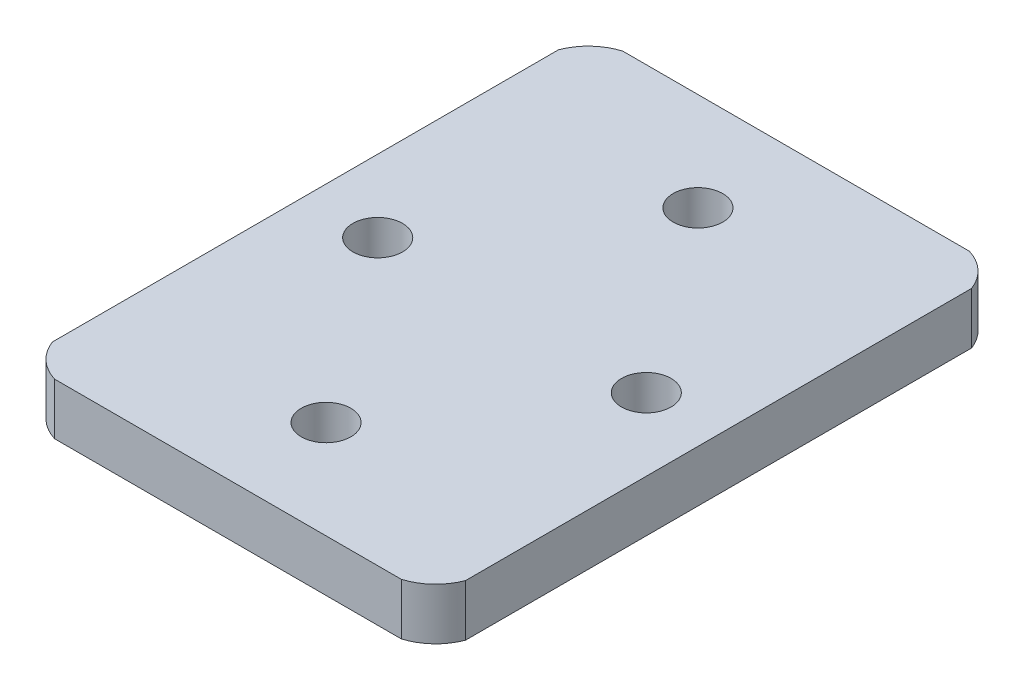
ISO-10303-21;
HEADER;
FILE_DESCRIPTION(('STEP AP214'),'2;1');
FILE_NAME('part.step','',(''),(''),'','','');
FILE_SCHEMA(('AUTOMOTIVE_DESIGN { 1 0 10303 214 1 1 1 1 }'));
ENDSEC;
DATA;
#1=APPLICATION_CONTEXT('core data for automotive mechanical design processes');
#2=APPLICATION_PROTOCOL_DEFINITION('international standard','automotive_design',2000,#1);
#3=PRODUCT_CONTEXT('',#1,'mechanical');
#4=PRODUCT('Part','Part','',(#3));
#5=PRODUCT_RELATED_PRODUCT_CATEGORY('part','',(#4));
#6=PRODUCT_DEFINITION_FORMATION('','',#4);
#7=PRODUCT_DEFINITION_CONTEXT('part definition',#1,'design');
#8=PRODUCT_DEFINITION('design','',#6,#7);
#9=PRODUCT_DEFINITION_SHAPE('','',#8);
#10=(LENGTH_UNIT() NAMED_UNIT(*) SI_UNIT(.MILLI.,.METRE.));
#11=(NAMED_UNIT(*) PLANE_ANGLE_UNIT() SI_UNIT($,.RADIAN.));
#12=(NAMED_UNIT(*) SI_UNIT($,.STERADIAN.) SOLID_ANGLE_UNIT());
#13=UNCERTAINTY_MEASURE_WITH_UNIT(LENGTH_MEASURE(1.E-05),#10,'distance_accuracy_value','');
#14=(GEOMETRIC_REPRESENTATION_CONTEXT(3) GLOBAL_UNCERTAINTY_ASSIGNED_CONTEXT((#13)) GLOBAL_UNIT_ASSIGNED_CONTEXT((#10,
#11,#12)) REPRESENTATION_CONTEXT('',''));
#15=CARTESIAN_POINT('',(0.,0.,0.));
#16=DIRECTION('',(0.,0.,1.));
#17=DIRECTION('',(1.,0.,0.));
#18=AXIS2_PLACEMENT_3D('',#15,#16,#17);
#19=CARTESIAN_POINT('',(15.3292042593997,5.,-28.2283542208789));
#20=DIRECTION('',(0.,-1.,0.));
#21=DIRECTION('',(0.,0.,-1.));
#22=AXIS2_PLACEMENT_3D('',#19,#20,#21);
#23=PLANE('',#22);
#24=CARTESIAN_POINT('',(15.3292042593997,5.,-28.2283542208789));
#25=DIRECTION('',(0.,1.,0.));
#26=DIRECTION('',(0.,0.,-1.));
#27=AXIS2_PLACEMENT_3D('',#24,#25,#26);
#28=CIRCLE('',#27,5.);
#29=CARTESIAN_POINT('',(20.,5.,-30.012637592317));
#30=VERTEX_POINT('',#29);
#31=CARTESIAN_POINT('',(16.7820059051109,5.,-33.012637592317));
#32=VERTEX_POINT('',#31);
#33=EDGE_CURVE('E149',#30,#32,#28,.T.);
#34=ORIENTED_EDGE('',*,*,#33,.T.);
#35=DIRECTION('',(-1.,0.,0.));
#36=VECTOR('',#35,1.);
#37=CARTESIAN_POINT('',(-16.7820059051109,5.,-33.012637592317));
#38=LINE('',#37,#36);
#39=CARTESIAN_POINT('',(-16.7820059051109,5.,-33.012637592317));
#40=VERTEX_POINT('',#39);
#41=EDGE_CURVE('E97',#32,#40,#38,.T.);
#42=ORIENTED_EDGE('',*,*,#41,.T.);
#43=CARTESIAN_POINT('',(-15.3292042593997,5.,-28.2283542208789));
#44=DIRECTION('',(0.,1.,0.));
#45=DIRECTION('',(0.,0.,1.));
#46=AXIS2_PLACEMENT_3D('',#43,#44,#45);
#47=CIRCLE('',#46,5.);
#48=CARTESIAN_POINT('',(-20.,5.,-30.012637592317));
#49=VERTEX_POINT('',#48);
#50=EDGE_CURVE('E164',#40,#49,#47,.T.);
#51=ORIENTED_EDGE('',*,*,#50,.T.);
#52=DIRECTION('',(0.,0.,1.));
#53=VECTOR('',#52,1.);
#54=CARTESIAN_POINT('',(-20.,5.,-30.012637592317));
#55=LINE('',#54,#53);
#56=CARTESIAN_POINT('',(-20.,5.,18.987362407683));
#57=VERTEX_POINT('',#56);
#58=EDGE_CURVE('E177',#49,#57,#55,.T.);
#59=ORIENTED_EDGE('',*,*,#58,.T.);
#60=CARTESIAN_POINT('',(-15.3292042593997,5.,17.2030790362449));
#61=DIRECTION('',(0.,1.,0.));
#62=DIRECTION('',(0.,0.,-1.));
#63=AXIS2_PLACEMENT_3D('',#60,#61,#62);
#64=CIRCLE('',#63,5.00000000000001);
#65=CARTESIAN_POINT('',(-16.7820059051109,5.,21.987362407683));
#66=VERTEX_POINT('',#65);
#67=EDGE_CURVE('E116',#57,#66,#64,.T.);
#68=ORIENTED_EDGE('',*,*,#67,.T.);
#69=DIRECTION('',(1.,0.,0.));
#70=VECTOR('',#69,1.);
#71=CARTESIAN_POINT('',(16.7820059051109,5.,21.987362407683));
#72=LINE('',#71,#70);
#73=CARTESIAN_POINT('',(16.7820059051109,5.,21.987362407683));
#74=VERTEX_POINT('',#73);
#75=EDGE_CURVE('E110',#66,#74,#72,.T.);
#76=ORIENTED_EDGE('',*,*,#75,.T.);
#77=CARTESIAN_POINT('',(15.3292042593997,5.,17.2030790362449));
#78=DIRECTION('',(0.,1.,0.));
#79=DIRECTION('',(0.,0.,1.));
#80=AXIS2_PLACEMENT_3D('',#77,#78,#79);
#81=CIRCLE('',#80,5.00000000000002);
#82=CARTESIAN_POINT('',(20.,5.,18.987362407683));
#83=VERTEX_POINT('',#82);
#84=EDGE_CURVE('E114',#74,#83,#81,.T.);
#85=ORIENTED_EDGE('',*,*,#84,.T.);
#86=DIRECTION('',(0.,0.,-1.));
#87=VECTOR('',#86,1.);
#88=CARTESIAN_POINT('',(20.,5.,-30.012637592317));
#89=LINE('',#88,#87);
#90=EDGE_CURVE('E54',#83,#30,#89,.T.);
#91=ORIENTED_EDGE('',*,*,#90,.T.);
#92=EDGE_LOOP('',(#34,#42,#51,#59,#68,#76,#85,#91));
#93=FACE_BOUND('',#92,.T.);
#94=CARTESIAN_POINT('',(0.,5.,-23.512637592317));
#95=DIRECTION('',(0.,1.,0.));
#96=DIRECTION('',(0.,0.,1.));
#97=AXIS2_PLACEMENT_3D('',#94,#95,#96);
#98=CIRCLE('',#97,2.4);
#99=CARTESIAN_POINT('',(0.,5.,-21.112637592317));
#100=VERTEX_POINT('',#99);
#101=EDGE_CURVE('E138',#100,#100,#98,.T.);
#102=ORIENTED_EDGE('',*,*,#101,.F.);
#103=EDGE_LOOP('',(#102));
#104=FACE_BOUND('',#103,.T.);
#105=CARTESIAN_POINT('',(-13.,5.,-5.51263759231702));
#106=DIRECTION('',(0.,1.,0.));
#107=DIRECTION('',(0.,0.,1.));
#108=AXIS2_PLACEMENT_3D('',#105,#106,#107);
#109=CIRCLE('',#108,2.4);
#110=CARTESIAN_POINT('',(-13.,5.,-3.11263759231702));
#111=VERTEX_POINT('',#110);
#112=EDGE_CURVE('E186',#111,#111,#109,.T.);
#113=ORIENTED_EDGE('',*,*,#112,.F.);
#114=EDGE_LOOP('',(#113));
#115=FACE_BOUND('',#114,.T.);
#116=CARTESIAN_POINT('',(0.,5.,12.487362407683));
#117=DIRECTION('',(0.,1.,0.));
#118=DIRECTION('',(0.,0.,-1.));
#119=AXIS2_PLACEMENT_3D('',#116,#117,#118);
#120=CIRCLE('',#119,2.4);
#121=CARTESIAN_POINT('',(0.,5.,10.087362407683));
#122=VERTEX_POINT('',#121);
#123=EDGE_CURVE('E192',#122,#122,#120,.T.);
#124=ORIENTED_EDGE('',*,*,#123,.F.);
#125=EDGE_LOOP('',(#124));
#126=FACE_BOUND('',#125,.T.);
#127=CARTESIAN_POINT('',(13.,5.,-5.51263759231703));
#128=DIRECTION('',(0.,1.,0.));
#129=DIRECTION('',(0.,0.,-1.));
#130=AXIS2_PLACEMENT_3D('',#127,#128,#129);
#131=CIRCLE('',#130,2.4);
#132=CARTESIAN_POINT('',(13.,5.,-7.91263759231703));
#133=VERTEX_POINT('',#132);
#134=EDGE_CURVE('E198',#133,#133,#131,.T.);
#135=ORIENTED_EDGE('',*,*,#134,.F.);
#136=EDGE_LOOP('',(#135));
#137=FACE_BOUND('',#136,.T.);
#138=ADVANCED_FACE('F37',(#93,#104,#115,#126,#137),#23,.F.);
#139=CARTESIAN_POINT('',(15.3292042593997,0.,-28.2283542208789));
#140=DIRECTION('',(0.,-1.,0.));
#141=DIRECTION('',(0.,0.,-1.));
#142=AXIS2_PLACEMENT_3D('',#139,#140,#141);
#143=PLANE('',#142);
#144=CARTESIAN_POINT('',(0.,0.,12.487362407683));
#145=DIRECTION('',(0.,1.,0.));
#146=DIRECTION('',(0.,0.,-1.));
#147=AXIS2_PLACEMENT_3D('',#144,#145,#146);
#148=CIRCLE('',#147,2.4);
#149=CARTESIAN_POINT('',(0.,0.,10.087362407683));
#150=VERTEX_POINT('',#149);
#151=EDGE_CURVE('E195',#150,#150,#148,.T.);
#152=ORIENTED_EDGE('',*,*,#151,.T.);
#153=EDGE_LOOP('',(#152));
#154=FACE_BOUND('',#153,.T.);
#155=CARTESIAN_POINT('',(0.,0.,-23.512637592317));
#156=DIRECTION('',(0.,1.,0.));
#157=DIRECTION('',(0.,0.,1.));
#158=AXIS2_PLACEMENT_3D('',#155,#156,#157);
#159=CIRCLE('',#158,2.4);
#160=CARTESIAN_POINT('',(0.,0.,-21.112637592317));
#161=VERTEX_POINT('',#160);
#162=EDGE_CURVE('E183',#161,#161,#159,.T.);
#163=ORIENTED_EDGE('',*,*,#162,.T.);
#164=EDGE_LOOP('',(#163));
#165=FACE_BOUND('',#164,.T.);
#166=CARTESIAN_POINT('',(15.3292042593997,0.,-28.2283542208789));
#167=DIRECTION('',(0.,1.,0.));
#168=DIRECTION('',(0.,0.,-1.));
#169=AXIS2_PLACEMENT_3D('',#166,#167,#168);
#170=CIRCLE('',#169,5.);
#171=CARTESIAN_POINT('',(20.,0.,-30.012637592317));
#172=VERTEX_POINT('',#171);
#173=CARTESIAN_POINT('',(16.7820059051109,0.,-33.012637592317));
#174=VERTEX_POINT('',#173);
#175=EDGE_CURVE('E134',#172,#174,#170,.T.);
#176=ORIENTED_EDGE('',*,*,#175,.F.);
#177=DIRECTION('',(0.,0.,-1.));
#178=VECTOR('',#177,1.);
#179=CARTESIAN_POINT('',(20.,0.,-30.012637592317));
#180=LINE('',#179,#178);
#181=CARTESIAN_POINT('',(20.,0.,18.987362407683));
#182=VERTEX_POINT('',#181);
#183=EDGE_CURVE('E89',#182,#172,#180,.T.);
#184=ORIENTED_EDGE('',*,*,#183,.F.);
#185=CARTESIAN_POINT('',(15.3292042593997,0.,17.2030790362449));
#186=DIRECTION('',(0.,1.,0.));
#187=DIRECTION('',(0.,0.,1.));
#188=AXIS2_PLACEMENT_3D('',#185,#186,#187);
#189=CIRCLE('',#188,5.00000000000002);
#190=CARTESIAN_POINT('',(16.7820059051109,0.,21.987362407683));
#191=VERTEX_POINT('',#190);
#192=EDGE_CURVE('E83',#191,#182,#189,.T.);
#193=ORIENTED_EDGE('',*,*,#192,.F.);
#194=DIRECTION('',(1.,0.,0.));
#195=VECTOR('',#194,1.);
#196=CARTESIAN_POINT('',(16.7820059051109,0.,21.987362407683));
#197=LINE('',#196,#195);
#198=CARTESIAN_POINT('',(-16.7820059051109,0.,21.987362407683));
#199=VERTEX_POINT('',#198);
#200=EDGE_CURVE('E124',#199,#191,#197,.T.);
#201=ORIENTED_EDGE('',*,*,#200,.F.);
#202=CARTESIAN_POINT('',(-15.3292042593997,0.,17.2030790362449));
#203=DIRECTION('',(0.,1.,0.));
#204=DIRECTION('',(0.,0.,-1.));
#205=AXIS2_PLACEMENT_3D('',#202,#203,#204);
#206=CIRCLE('',#205,5.00000000000001);
#207=CARTESIAN_POINT('',(-20.,0.,18.987362407683));
#208=VERTEX_POINT('',#207);
#209=EDGE_CURVE('E144',#208,#199,#206,.T.);
#210=ORIENTED_EDGE('',*,*,#209,.F.);
#211=DIRECTION('',(0.,0.,1.));
#212=VECTOR('',#211,1.);
#213=CARTESIAN_POINT('',(-20.,0.,-30.012637592317));
#214=LINE('',#213,#212);
#215=CARTESIAN_POINT('',(-20.,0.,-30.012637592317));
#216=VERTEX_POINT('',#215);
#217=EDGE_CURVE('E142',#216,#208,#214,.T.);
#218=ORIENTED_EDGE('',*,*,#217,.F.);
#219=CARTESIAN_POINT('',(-15.3292042593997,0.,-28.2283542208789));
#220=DIRECTION('',(0.,1.,0.));
#221=DIRECTION('',(0.,0.,1.));
#222=AXIS2_PLACEMENT_3D('',#219,#220,#221);
#223=CIRCLE('',#222,5.);
#224=CARTESIAN_POINT('',(-16.7820059051109,0.,-33.012637592317));
#225=VERTEX_POINT('',#224);
#226=EDGE_CURVE('E140',#225,#216,#223,.T.);
#227=ORIENTED_EDGE('',*,*,#226,.F.);
#228=DIRECTION('',(-1.,0.,0.));
#229=VECTOR('',#228,1.);
#230=CARTESIAN_POINT('',(-16.7820059051109,0.,-33.012637592317));
#231=LINE('',#230,#229);
#232=EDGE_CURVE('E137',#174,#225,#231,.T.);
#233=ORIENTED_EDGE('',*,*,#232,.F.);
#234=EDGE_LOOP('',(#176,#184,#193,#201,#210,#218,#227,#233));
#235=FACE_BOUND('',#234,.T.);
#236=CARTESIAN_POINT('',(-13.,0.,-5.51263759231702));
#237=DIRECTION('',(0.,1.,0.));
#238=DIRECTION('',(0.,0.,1.));
#239=AXIS2_PLACEMENT_3D('',#236,#237,#238);
#240=CIRCLE('',#239,2.4);
#241=CARTESIAN_POINT('',(-13.,0.,-3.11263759231702));
#242=VERTEX_POINT('',#241);
#243=EDGE_CURVE('E189',#242,#242,#240,.T.);
#244=ORIENTED_EDGE('',*,*,#243,.T.);
#245=EDGE_LOOP('',(#244));
#246=FACE_BOUND('',#245,.T.);
#247=CARTESIAN_POINT('',(13.,0.,-5.51263759231703));
#248=DIRECTION('',(0.,1.,0.));
#249=DIRECTION('',(0.,0.,-1.));
#250=AXIS2_PLACEMENT_3D('',#247,#248,#249);
#251=CIRCLE('',#250,2.4);
#252=CARTESIAN_POINT('',(13.,0.,-7.91263759231703));
#253=VERTEX_POINT('',#252);
#254=EDGE_CURVE('E201',#253,#253,#251,.T.);
#255=ORIENTED_EDGE('',*,*,#254,.T.);
#256=EDGE_LOOP('',(#255));
#257=FACE_BOUND('',#256,.T.);
#258=ADVANCED_FACE('F168',(#154,#165,#235,#246,#257),#143,.T.);
#259=CARTESIAN_POINT('',(15.3292042593997,5.,-28.2283542208789));
#260=DIRECTION('',(0.,-1.,0.));
#261=DIRECTION('',(0.,0.,-1.));
#262=AXIS2_PLACEMENT_3D('',#259,#260,#261);
#263=CYLINDRICAL_SURFACE('',#262,5.);
#264=ORIENTED_EDGE('',*,*,#175,.T.);
#265=DIRECTION('',(0.,-1.,0.));
#266=VECTOR('',#265,1.);
#267=CARTESIAN_POINT('',(16.7820059051109,5.,-33.012637592317));
#268=LINE('',#267,#266);
#269=EDGE_CURVE('E11',#32,#174,#268,.T.);
#270=ORIENTED_EDGE('',*,*,#269,.F.);
#271=ORIENTED_EDGE('',*,*,#33,.F.);
#272=DIRECTION('',(0.,-1.,0.));
#273=VECTOR('',#272,1.);
#274=CARTESIAN_POINT('',(20.,5.,-30.012637592317));
#275=LINE('',#274,#273);
#276=EDGE_CURVE('E130',#30,#172,#275,.T.);
#277=ORIENTED_EDGE('',*,*,#276,.T.);
#278=EDGE_LOOP('',(#264,#270,#271,#277));
#279=FACE_BOUND('',#278,.T.);
#280=ADVANCED_FACE('F39',(#279),#263,.T.);
#281=CARTESIAN_POINT('',(-16.7820059051109,5.,-33.012637592317));
#282=DIRECTION('',(0.,0.,1.));
#283=DIRECTION('',(1.,0.,0.));
#284=AXIS2_PLACEMENT_3D('',#281,#282,#283);
#285=PLANE('',#284);
#286=ORIENTED_EDGE('',*,*,#232,.T.);
#287=DIRECTION('',(0.,-1.,0.));
#288=VECTOR('',#287,1.);
#289=CARTESIAN_POINT('',(-16.7820059051109,5.,-33.012637592317));
#290=LINE('',#289,#288);
#291=EDGE_CURVE('E46',#40,#225,#290,.T.);
#292=ORIENTED_EDGE('',*,*,#291,.F.);
#293=ORIENTED_EDGE('',*,*,#41,.F.);
#294=ORIENTED_EDGE('',*,*,#269,.T.);
#295=EDGE_LOOP('',(#286,#292,#293,#294));
#296=FACE_BOUND('',#295,.T.);
#297=ADVANCED_FACE('F233',(#296),#285,.F.);
#298=CARTESIAN_POINT('',(-15.3292042593997,5.,-28.2283542208789));
#299=DIRECTION('',(0.,-1.,0.));
#300=DIRECTION('',(0.,0.,-1.));
#301=AXIS2_PLACEMENT_3D('',#298,#299,#300);
#302=CYLINDRICAL_SURFACE('',#301,5.);
#303=ORIENTED_EDGE('',*,*,#226,.T.);
#304=DIRECTION('',(0.,-1.,0.));
#305=VECTOR('',#304,1.);
#306=CARTESIAN_POINT('',(-20.,5.,-30.012637592317));
#307=LINE('',#306,#305);
#308=EDGE_CURVE('E156',#49,#216,#307,.T.);
#309=ORIENTED_EDGE('',*,*,#308,.F.);
#310=ORIENTED_EDGE('',*,*,#50,.F.);
#311=ORIENTED_EDGE('',*,*,#291,.T.);
#312=EDGE_LOOP('',(#303,#309,#310,#311));
#313=FACE_BOUND('',#312,.T.);
#314=ADVANCED_FACE('F162',(#313),#302,.T.);
#315=CARTESIAN_POINT('',(-20.,5.,-30.012637592317));
#316=DIRECTION('',(1.,0.,0.));
#317=DIRECTION('',(0.,0.,-1.));
#318=AXIS2_PLACEMENT_3D('',#315,#316,#317);
#319=PLANE('',#318);
#320=ORIENTED_EDGE('',*,*,#217,.T.);
#321=DIRECTION('',(0.,-1.,0.));
#322=VECTOR('',#321,1.);
#323=CARTESIAN_POINT('',(-20.,5.,18.987362407683));
#324=LINE('',#323,#322);
#325=EDGE_CURVE('E153',#57,#208,#324,.T.);
#326=ORIENTED_EDGE('',*,*,#325,.F.);
#327=ORIENTED_EDGE('',*,*,#58,.F.);
#328=ORIENTED_EDGE('',*,*,#308,.T.);
#329=EDGE_LOOP('',(#320,#326,#327,#328));
#330=FACE_BOUND('',#329,.T.);
#331=ADVANCED_FACE('F173',(#330),#319,.F.);
#332=CARTESIAN_POINT('',(-15.3292042593997,5.,17.2030790362449));
#333=DIRECTION('',(0.,-1.,0.));
#334=DIRECTION('',(0.,0.,-1.));
#335=AXIS2_PLACEMENT_3D('',#332,#333,#334);
#336=CYLINDRICAL_SURFACE('',#335,5.00000000000001);
#337=ORIENTED_EDGE('',*,*,#209,.T.);
#338=DIRECTION('',(0.,-1.,0.));
#339=VECTOR('',#338,1.);
#340=CARTESIAN_POINT('',(-16.7820059051109,5.,21.987362407683));
#341=LINE('',#340,#339);
#342=EDGE_CURVE('E125',#66,#199,#341,.T.);
#343=ORIENTED_EDGE('',*,*,#342,.F.);
#344=ORIENTED_EDGE('',*,*,#67,.F.);
#345=ORIENTED_EDGE('',*,*,#325,.T.);
#346=EDGE_LOOP('',(#337,#343,#344,#345));
#347=FACE_BOUND('',#346,.T.);
#348=ADVANCED_FACE('F176',(#347),#336,.T.);
#349=CARTESIAN_POINT('',(16.7820059051109,5.,21.987362407683));
#350=DIRECTION('',(0.,0.,-1.));
#351=DIRECTION('',(-1.,0.,0.));
#352=AXIS2_PLACEMENT_3D('',#349,#350,#351);
#353=PLANE('',#352);
#354=ORIENTED_EDGE('',*,*,#200,.T.);
#355=DIRECTION('',(0.,-1.,0.));
#356=VECTOR('',#355,1.);
#357=CARTESIAN_POINT('',(16.7820059051109,5.,21.987362407683));
#358=LINE('',#357,#356);
#359=EDGE_CURVE('E121',#74,#191,#358,.T.);
#360=ORIENTED_EDGE('',*,*,#359,.F.);
#361=ORIENTED_EDGE('',*,*,#75,.F.);
#362=ORIENTED_EDGE('',*,*,#342,.T.);
#363=EDGE_LOOP('',(#354,#360,#361,#362));
#364=FACE_BOUND('',#363,.T.);
#365=ADVANCED_FACE('F122',(#364),#353,.F.);
#366=CARTESIAN_POINT('',(15.3292042593997,5.,17.2030790362449));
#367=DIRECTION('',(0.,-1.,0.));
#368=DIRECTION('',(0.,0.,-1.));
#369=AXIS2_PLACEMENT_3D('',#366,#367,#368);
#370=CYLINDRICAL_SURFACE('',#369,5.00000000000002);
#371=ORIENTED_EDGE('',*,*,#192,.T.);
#372=DIRECTION('',(0.,-1.,0.));
#373=VECTOR('',#372,1.);
#374=CARTESIAN_POINT('',(20.,5.,18.987362407683));
#375=LINE('',#374,#373);
#376=EDGE_CURVE('E126',#83,#182,#375,.T.);
#377=ORIENTED_EDGE('',*,*,#376,.F.);
#378=ORIENTED_EDGE('',*,*,#84,.F.);
#379=ORIENTED_EDGE('',*,*,#359,.T.);
#380=EDGE_LOOP('',(#371,#377,#378,#379));
#381=FACE_BOUND('',#380,.T.);
#382=ADVANCED_FACE('F128',(#381),#370,.T.);
#383=CARTESIAN_POINT('',(20.,5.,-30.012637592317));
#384=DIRECTION('',(-1.,0.,0.));
#385=DIRECTION('',(0.,0.,1.));
#386=AXIS2_PLACEMENT_3D('',#383,#384,#385);
#387=PLANE('',#386);
#388=ORIENTED_EDGE('',*,*,#183,.T.);
#389=ORIENTED_EDGE('',*,*,#276,.F.);
#390=ORIENTED_EDGE('',*,*,#90,.F.);
#391=ORIENTED_EDGE('',*,*,#376,.T.);
#392=EDGE_LOOP('',(#388,#389,#390,#391));
#393=FACE_BOUND('',#392,.T.);
#394=ADVANCED_FACE('F221',(#393),#387,.F.);
#395=CARTESIAN_POINT('',(0.,5.,-23.512637592317));
#396=DIRECTION('',(0.,-1.,0.));
#397=DIRECTION('',(0.,0.,-1.));
#398=AXIS2_PLACEMENT_3D('',#395,#396,#397);
#399=CYLINDRICAL_SURFACE('',#398,2.4);
#400=ORIENTED_EDGE('',*,*,#101,.T.);
#401=EDGE_LOOP('',(#400));
#402=FACE_BOUND('',#401,.T.);
#403=ORIENTED_EDGE('',*,*,#162,.F.);
#404=EDGE_LOOP('',(#403));
#405=FACE_BOUND('',#404,.T.);
#406=ADVANCED_FACE('F218',(#402,#405),#399,.F.);
#407=CARTESIAN_POINT('',(-13.,5.,-5.51263759231702));
#408=DIRECTION('',(0.,-1.,0.));
#409=DIRECTION('',(0.,0.,-1.));
#410=AXIS2_PLACEMENT_3D('',#407,#408,#409);
#411=CYLINDRICAL_SURFACE('',#410,2.4);
#412=ORIENTED_EDGE('',*,*,#112,.T.);
#413=EDGE_LOOP('',(#412));
#414=FACE_BOUND('',#413,.T.);
#415=ORIENTED_EDGE('',*,*,#243,.F.);
#416=EDGE_LOOP('',(#415));
#417=FACE_BOUND('',#416,.T.);
#418=ADVANCED_FACE('F309',(#414,#417),#411,.F.);
#419=CARTESIAN_POINT('',(0.,5.,12.487362407683));
#420=DIRECTION('',(0.,-1.,0.));
#421=DIRECTION('',(0.,0.,-1.));
#422=AXIS2_PLACEMENT_3D('',#419,#420,#421);
#423=CYLINDRICAL_SURFACE('',#422,2.4);
#424=ORIENTED_EDGE('',*,*,#123,.T.);
#425=EDGE_LOOP('',(#424));
#426=FACE_BOUND('',#425,.T.);
#427=ORIENTED_EDGE('',*,*,#151,.F.);
#428=EDGE_LOOP('',(#427));
#429=FACE_BOUND('',#428,.T.);
#430=ADVANCED_FACE('F318',(#426,#429),#423,.F.);
#431=CARTESIAN_POINT('',(13.,5.,-5.51263759231703));
#432=DIRECTION('',(0.,-1.,0.));
#433=DIRECTION('',(0.,0.,-1.));
#434=AXIS2_PLACEMENT_3D('',#431,#432,#433);
#435=CYLINDRICAL_SURFACE('',#434,2.4);
#436=ORIENTED_EDGE('',*,*,#134,.T.);
#437=EDGE_LOOP('',(#436));
#438=FACE_BOUND('',#437,.T.);
#439=ORIENTED_EDGE('',*,*,#254,.F.);
#440=EDGE_LOOP('',(#439));
#441=FACE_BOUND('',#440,.T.);
#442=ADVANCED_FACE('F207',(#438,#441),#435,.F.);
#443=CLOSED_SHELL('',(#138,#258,#280,#297,#314,#331,#348,#365,#382,#394,#406,#418,#430,#442));
#444=MANIFOLD_SOLID_BREP('B2',#443);
#445=ADVANCED_BREP_SHAPE_REPRESENTATION('',(#18,#444),#14);
#446=SHAPE_DEFINITION_REPRESENTATION(#9,#445);
ENDSEC;
END-ISO-10303-21;
